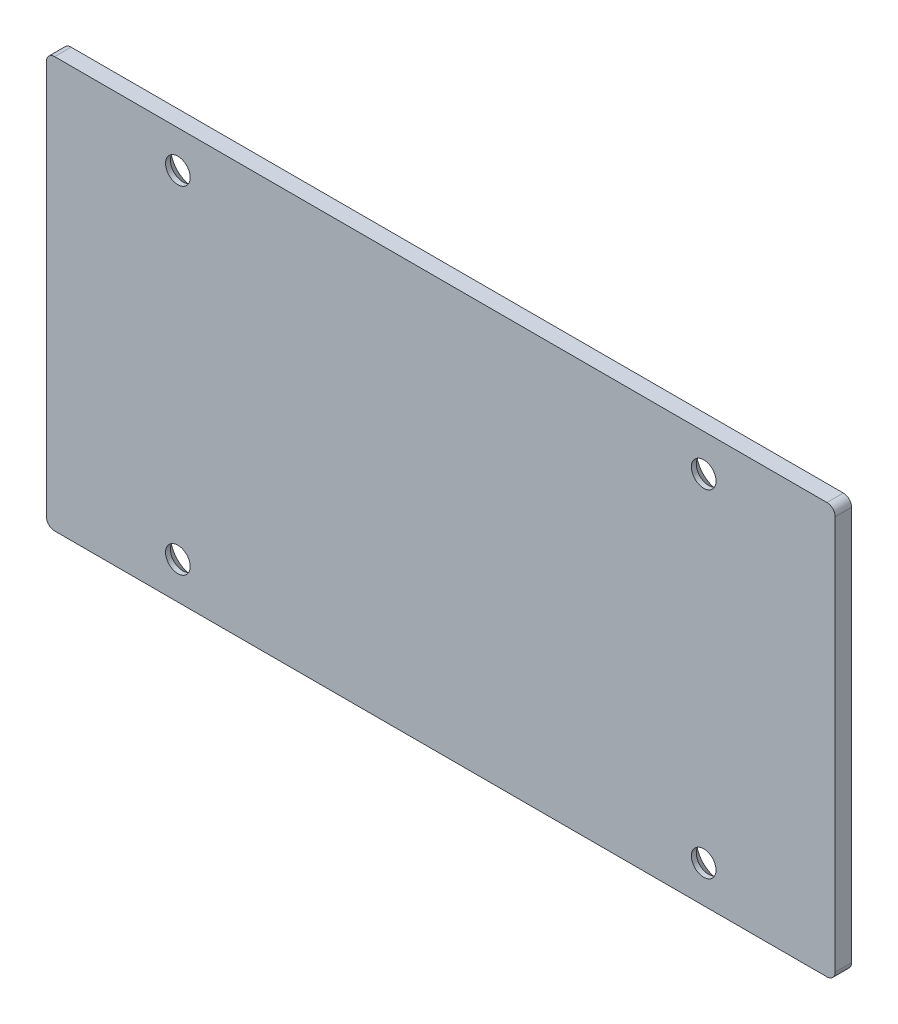
ISO-10303-21;
HEADER;
FILE_DESCRIPTION(('STEP AP214'),'2;1');
FILE_NAME('part.step','',(''),(''),'','','');
FILE_SCHEMA(('AUTOMOTIVE_DESIGN { 1 0 10303 214 1 1 1 1 }'));
ENDSEC;
DATA;
#1=APPLICATION_CONTEXT('core data for automotive mechanical design processes');
#2=APPLICATION_PROTOCOL_DEFINITION('international standard','automotive_design',2000,#1);
#3=PRODUCT_CONTEXT('',#1,'mechanical');
#4=PRODUCT('Part','Part','',(#3));
#5=PRODUCT_RELATED_PRODUCT_CATEGORY('part','',(#4));
#6=PRODUCT_DEFINITION_FORMATION('','',#4);
#7=PRODUCT_DEFINITION_CONTEXT('part definition',#1,'design');
#8=PRODUCT_DEFINITION('design','',#6,#7);
#9=PRODUCT_DEFINITION_SHAPE('','',#8);
#10=(LENGTH_UNIT() NAMED_UNIT(*) SI_UNIT(.MILLI.,.METRE.));
#11=(NAMED_UNIT(*) PLANE_ANGLE_UNIT() SI_UNIT($,.RADIAN.));
#12=(NAMED_UNIT(*) SI_UNIT($,.STERADIAN.) SOLID_ANGLE_UNIT());
#13=UNCERTAINTY_MEASURE_WITH_UNIT(LENGTH_MEASURE(1.E-05),#10,'distance_accuracy_value','');
#14=(GEOMETRIC_REPRESENTATION_CONTEXT(3) GLOBAL_UNCERTAINTY_ASSIGNED_CONTEXT((#13)) GLOBAL_UNIT_ASSIGNED_CONTEXT((#10,
#11,#12)) REPRESENTATION_CONTEXT('',''));
#15=CARTESIAN_POINT('',(0.,0.,0.));
#16=DIRECTION('',(0.,0.,1.));
#17=DIRECTION('',(1.,0.,0.));
#18=AXIS2_PLACEMENT_3D('',#15,#16,#17);
#19=CARTESIAN_POINT('',(83.5501340685274,23.0437550274658,58.7537987872683));
#20=DIRECTION('',(0.,0.,-1.));
#21=DIRECTION('',(-1.,0.,0.));
#22=AXIS2_PLACEMENT_3D('',#19,#20,#21);
#23=PLANE('',#22);
#24=CARTESIAN_POINT('',(68.5501340685274,26.5437550274658,58.7537987872683));
#25=DIRECTION('',(0.,0.,-1.));
#26=DIRECTION('',(-1.,0.,0.));
#27=AXIS2_PLACEMENT_3D('',#24,#25,#26);
#28=CIRCLE('',#27,2.9);
#29=CARTESIAN_POINT('',(65.6501340685274,26.5437550274658,58.7537987872683));
#30=VERTEX_POINT('',#29);
#31=EDGE_CURVE('E176',#30,#30,#28,.F.);
#32=ORIENTED_EDGE('',*,*,#31,.T.);
#33=EDGE_LOOP('',(#32));
#34=FACE_BOUND('',#33,.T.);
#35=CARTESIAN_POINT('',(4.55013406852741,26.5437550274658,58.7537987872683));
#36=DIRECTION('',(0.,0.,-1.));
#37=DIRECTION('',(-1.,0.,0.));
#38=AXIS2_PLACEMENT_3D('',#35,#36,#37);
#39=CIRCLE('',#38,2.9);
#40=CARTESIAN_POINT('',(1.65013406852741,26.5437550274658,58.7537987872683));
#41=VERTEX_POINT('',#40);
#42=EDGE_CURVE('E173',#41,#41,#39,.F.);
#43=ORIENTED_EDGE('',*,*,#42,.T.);
#44=EDGE_LOOP('',(#43));
#45=FACE_BOUND('',#44,.T.);
#46=CARTESIAN_POINT('',(4.55013406852741,67.5437550274658,58.7537987872683));
#47=DIRECTION('',(0.,0.,-1.));
#48=DIRECTION('',(-1.,0.,0.));
#49=AXIS2_PLACEMENT_3D('',#46,#47,#48);
#50=CIRCLE('',#49,2.9);
#51=CARTESIAN_POINT('',(1.65013406852741,67.5437550274658,58.7537987872683));
#52=VERTEX_POINT('',#51);
#53=EDGE_CURVE('E170',#52,#52,#50,.F.);
#54=ORIENTED_EDGE('',*,*,#53,.T.);
#55=EDGE_LOOP('',(#54));
#56=FACE_BOUND('',#55,.T.);
#57=CARTESIAN_POINT('',(68.5501340685274,67.5437550274658,58.7537987872683));
#58=DIRECTION('',(0.,0.,-1.));
#59=DIRECTION('',(-1.,0.,0.));
#60=AXIS2_PLACEMENT_3D('',#57,#58,#59);
#61=CIRCLE('',#60,2.9);
#62=CARTESIAN_POINT('',(65.6501340685274,67.5437550274658,58.7537987872683));
#63=VERTEX_POINT('',#62);
#64=EDGE_CURVE('E167',#63,#63,#61,.F.);
#65=ORIENTED_EDGE('',*,*,#64,.T.);
#66=EDGE_LOOP('',(#65));
#67=FACE_BOUND('',#66,.T.);
#68=DIRECTION('',(0.,-1.,0.));
#69=VECTOR('',#68,1.);
#70=CARTESIAN_POINT('',(84.5501340685274,29.5437550274658,58.7537987872683));
#71=LINE('',#70,#69);
#72=CARTESIAN_POINT('',(84.5501340685274,71.0437550274658,58.7537987872683));
#73=VERTEX_POINT('',#72);
#74=CARTESIAN_POINT('',(84.5501340685274,23.0437550274658,58.7537987872683));
#75=VERTEX_POINT('',#74);
#76=EDGE_CURVE('E51',#73,#75,#71,.T.);
#77=ORIENTED_EDGE('',*,*,#76,.T.);
#78=CARTESIAN_POINT('',(83.5501340685274,23.0437550274658,58.7537987872683));
#79=DIRECTION('',(0.,0.,-1.));
#80=DIRECTION('',(-1.,0.,0.));
#81=AXIS2_PLACEMENT_3D('',#78,#79,#80);
#82=CIRCLE('',#81,1.);
#83=CARTESIAN_POINT('',(83.5501340685274,22.0437550274658,58.7537987872683));
#84=VERTEX_POINT('',#83);
#85=EDGE_CURVE('E97',#75,#84,#82,.T.);
#86=ORIENTED_EDGE('',*,*,#85,.T.);
#87=DIRECTION('',(-1.,0.,0.));
#88=VECTOR('',#87,1.);
#89=CARTESIAN_POINT('',(83.5501340685274,22.0437550274658,58.7537987872683));
#90=LINE('',#89,#88);
#91=CARTESIAN_POINT('',(-10.4498659314726,22.0437550274658,58.7537987872683));
#92=VERTEX_POINT('',#91);
#93=EDGE_CURVE('E271',#84,#92,#90,.T.);
#94=ORIENTED_EDGE('',*,*,#93,.T.);
#95=CARTESIAN_POINT('',(-10.4498659314726,23.0437550274658,58.7537987872683));
#96=DIRECTION('',(0.,0.,-1.));
#97=DIRECTION('',(-1.,0.,0.));
#98=AXIS2_PLACEMENT_3D('',#95,#96,#97);
#99=CIRCLE('',#98,1.);
#100=CARTESIAN_POINT('',(-11.4498659314726,23.0437550274658,58.7537987872683));
#101=VERTEX_POINT('',#100);
#102=EDGE_CURVE('E273',#92,#101,#99,.T.);
#103=ORIENTED_EDGE('',*,*,#102,.T.);
#104=DIRECTION('',(0.,1.,0.));
#105=VECTOR('',#104,1.);
#106=CARTESIAN_POINT('',(-11.4498659314726,23.0437550274658,58.7537987872683));
#107=LINE('',#106,#105);
#108=CARTESIAN_POINT('',(-11.4498659314726,71.0437550274658,58.7537987872683));
#109=VERTEX_POINT('',#108);
#110=EDGE_CURVE('E116',#101,#109,#107,.T.);
#111=ORIENTED_EDGE('',*,*,#110,.T.);
#112=CARTESIAN_POINT('',(-10.4498659314726,71.0437550274658,58.7537987872683));
#113=DIRECTION('',(0.,0.,-1.));
#114=DIRECTION('',(-1.,0.,0.));
#115=AXIS2_PLACEMENT_3D('',#112,#113,#114);
#116=CIRCLE('',#115,1.);
#117=CARTESIAN_POINT('',(-10.4498659314726,72.0437550274658,58.7537987872683));
#118=VERTEX_POINT('',#117);
#119=EDGE_CURVE('E111',#109,#118,#116,.T.);
#120=ORIENTED_EDGE('',*,*,#119,.T.);
#121=DIRECTION('',(1.,0.,0.));
#122=VECTOR('',#121,1.);
#123=CARTESIAN_POINT('',(-10.4498659314726,72.0437550274658,58.7537987872683));
#124=LINE('',#123,#122);
#125=CARTESIAN_POINT('',(83.5501340685274,72.0437550274658,58.7537987872683));
#126=VERTEX_POINT('',#125);
#127=EDGE_CURVE('E114',#118,#126,#124,.T.);
#128=ORIENTED_EDGE('',*,*,#127,.T.);
#129=CARTESIAN_POINT('',(83.5501340685274,71.0437550274658,58.7537987872683));
#130=DIRECTION('',(0.,0.,-1.));
#131=DIRECTION('',(-1.,0.,0.));
#132=AXIS2_PLACEMENT_3D('',#129,#130,#131);
#133=CIRCLE('',#132,1.);
#134=EDGE_CURVE('E130',#126,#73,#133,.T.);
#135=ORIENTED_EDGE('',*,*,#134,.T.);
#136=EDGE_LOOP('',(#77,#86,#94,#103,#111,#120,#128,#135));
#137=FACE_BOUND('',#136,.T.);
#138=ADVANCED_FACE('F34',(#34,#45,#56,#67,#137),#23,.T.);
#139=CARTESIAN_POINT('',(83.5501340685274,23.0437550274658,60.7537987872683));
#140=DIRECTION('',(0.,0.,-1.));
#141=DIRECTION('',(-1.,0.,0.));
#142=AXIS2_PLACEMENT_3D('',#139,#140,#141);
#143=PLANE('',#142);
#144=CARTESIAN_POINT('',(83.5501340685274,23.0437550274658,60.7537987872683));
#145=DIRECTION('',(0.,0.,-1.));
#146=DIRECTION('',(-1.,0.,0.));
#147=AXIS2_PLACEMENT_3D('',#144,#145,#146);
#148=CIRCLE('',#147,1.);
#149=CARTESIAN_POINT('',(84.5501340685274,23.0437550274658,60.7537987872683));
#150=VERTEX_POINT('',#149);
#151=CARTESIAN_POINT('',(83.5501340685274,22.0437550274658,60.7537987872683));
#152=VERTEX_POINT('',#151);
#153=EDGE_CURVE('E136',#150,#152,#148,.T.);
#154=ORIENTED_EDGE('',*,*,#153,.F.);
#155=DIRECTION('',(0.,-1.,0.));
#156=VECTOR('',#155,1.);
#157=CARTESIAN_POINT('',(84.5501340685274,64.5437550274658,60.7537987872683));
#158=LINE('',#157,#156);
#159=CARTESIAN_POINT('',(84.5501340685274,71.0437550274658,60.7537987872683));
#160=VERTEX_POINT('',#159);
#161=EDGE_CURVE('E88',#160,#150,#158,.T.);
#162=ORIENTED_EDGE('',*,*,#161,.F.);
#163=CARTESIAN_POINT('',(83.5501340685274,71.0437550274658,60.7537987872683));
#164=DIRECTION('',(0.,0.,-1.));
#165=DIRECTION('',(-1.,0.,0.));
#166=AXIS2_PLACEMENT_3D('',#163,#164,#165);
#167=CIRCLE('',#166,1.);
#168=CARTESIAN_POINT('',(83.5501340685274,72.0437550274658,60.7537987872683));
#169=VERTEX_POINT('',#168);
#170=EDGE_CURVE('E147',#169,#160,#167,.T.);
#171=ORIENTED_EDGE('',*,*,#170,.F.);
#172=DIRECTION('',(1.,0.,0.));
#173=VECTOR('',#172,1.);
#174=CARTESIAN_POINT('',(-10.4498659314726,72.0437550274658,60.7537987872683));
#175=LINE('',#174,#173);
#176=CARTESIAN_POINT('',(-10.4498659314726,72.0437550274658,60.7537987872683));
#177=VERTEX_POINT('',#176);
#178=EDGE_CURVE('E81',#177,#169,#175,.T.);
#179=ORIENTED_EDGE('',*,*,#178,.F.);
#180=CARTESIAN_POINT('',(-10.4498659314726,71.0437550274658,60.7537987872683));
#181=DIRECTION('',(0.,0.,-1.));
#182=DIRECTION('',(-1.,0.,0.));
#183=AXIS2_PLACEMENT_3D('',#180,#181,#182);
#184=CIRCLE('',#183,1.);
#185=CARTESIAN_POINT('',(-11.4498659314726,71.0437550274658,60.7537987872683));
#186=VERTEX_POINT('',#185);
#187=EDGE_CURVE('E124',#186,#177,#184,.T.);
#188=ORIENTED_EDGE('',*,*,#187,.F.);
#189=DIRECTION('',(0.,1.,0.));
#190=VECTOR('',#189,1.);
#191=CARTESIAN_POINT('',(-11.4498659314726,23.0437550274658,60.7537987872683));
#192=LINE('',#191,#190);
#193=CARTESIAN_POINT('',(-11.4498659314726,23.0437550274658,60.7537987872683));
#194=VERTEX_POINT('',#193);
#195=EDGE_CURVE('E143',#194,#186,#192,.T.);
#196=ORIENTED_EDGE('',*,*,#195,.F.);
#197=CARTESIAN_POINT('',(-10.4498659314726,23.0437550274658,60.7537987872683));
#198=DIRECTION('',(0.,0.,-1.));
#199=DIRECTION('',(-1.,0.,0.));
#200=AXIS2_PLACEMENT_3D('',#197,#198,#199);
#201=CIRCLE('',#200,1.);
#202=CARTESIAN_POINT('',(-10.4498659314726,22.0437550274658,60.7537987872683));
#203=VERTEX_POINT('',#202);
#204=EDGE_CURVE('E141',#203,#194,#201,.T.);
#205=ORIENTED_EDGE('',*,*,#204,.F.);
#206=DIRECTION('',(-1.,0.,0.));
#207=VECTOR('',#206,1.);
#208=CARTESIAN_POINT('',(83.5501340685274,22.0437550274658,60.7537987872683));
#209=LINE('',#208,#207);
#210=EDGE_CURVE('E138',#152,#203,#209,.T.);
#211=ORIENTED_EDGE('',*,*,#210,.F.);
#212=EDGE_LOOP('',(#154,#162,#171,#179,#188,#196,#205,#211));
#213=FACE_BOUND('',#212,.T.);
#214=CARTESIAN_POINT('',(4.55013406852741,67.5437550274658,60.7537987872683));
#215=DIRECTION('',(0.,0.,-1.));
#216=DIRECTION('',(-1.,0.,0.));
#217=AXIS2_PLACEMENT_3D('',#214,#215,#216);
#218=CIRCLE('',#217,1.5);
#219=CARTESIAN_POINT('',(3.05013406852741,67.5437550274658,60.7537987872683));
#220=VERTEX_POINT('',#219);
#221=EDGE_CURVE('E139',#220,#220,#218,.T.);
#222=ORIENTED_EDGE('',*,*,#221,.T.);
#223=EDGE_LOOP('',(#222));
#224=FACE_BOUND('',#223,.T.);
#225=CARTESIAN_POINT('',(68.5501340685274,67.5437550274658,60.7537987872683));
#226=DIRECTION('',(0.,0.,-1.));
#227=DIRECTION('',(-1.,0.,0.));
#228=AXIS2_PLACEMENT_3D('',#225,#226,#227);
#229=CIRCLE('',#228,1.5);
#230=CARTESIAN_POINT('',(67.0501340685274,67.5437550274658,60.7537987872683));
#231=VERTEX_POINT('',#230);
#232=EDGE_CURVE('E259',#231,#231,#229,.T.);
#233=ORIENTED_EDGE('',*,*,#232,.T.);
#234=EDGE_LOOP('',(#233));
#235=FACE_BOUND('',#234,.T.);
#236=CARTESIAN_POINT('',(68.5501340685274,26.5437550274658,60.7537987872683));
#237=DIRECTION('',(0.,0.,-1.));
#238=DIRECTION('',(-1.,0.,0.));
#239=AXIS2_PLACEMENT_3D('',#236,#237,#238);
#240=CIRCLE('',#239,1.5);
#241=CARTESIAN_POINT('',(67.0501340685274,26.5437550274658,60.7537987872683));
#242=VERTEX_POINT('',#241);
#243=EDGE_CURVE('E257',#242,#242,#240,.T.);
#244=ORIENTED_EDGE('',*,*,#243,.T.);
#245=EDGE_LOOP('',(#244));
#246=FACE_BOUND('',#245,.T.);
#247=CARTESIAN_POINT('',(4.55013406852741,26.5437550274658,60.7537987872683));
#248=DIRECTION('',(0.,0.,-1.));
#249=DIRECTION('',(-1.,0.,0.));
#250=AXIS2_PLACEMENT_3D('',#247,#248,#249);
#251=CIRCLE('',#250,1.5);
#252=CARTESIAN_POINT('',(3.05013406852741,26.5437550274658,60.7537987872683));
#253=VERTEX_POINT('',#252);
#254=EDGE_CURVE('E260',#253,#253,#251,.T.);
#255=ORIENTED_EDGE('',*,*,#254,.T.);
#256=EDGE_LOOP('',(#255));
#257=FACE_BOUND('',#256,.T.);
#258=ADVANCED_FACE('F201',(#213,#224,#235,#246,#257),#143,.F.);
#259=CARTESIAN_POINT('',(83.5501340685274,23.0437550274658,58.7537987872683));
#260=DIRECTION('',(0.,0.,1.));
#261=DIRECTION('',(1.,0.,0.));
#262=AXIS2_PLACEMENT_3D('',#259,#260,#261);
#263=CYLINDRICAL_SURFACE('',#262,1.);
#264=ORIENTED_EDGE('',*,*,#153,.T.);
#265=DIRECTION('',(0.,0.,1.));
#266=VECTOR('',#265,1.);
#267=CARTESIAN_POINT('',(83.5501340685274,22.0437550274658,58.7537987872683));
#268=LINE('',#267,#266);
#269=EDGE_CURVE('E159',#84,#152,#268,.T.);
#270=ORIENTED_EDGE('',*,*,#269,.F.);
#271=ORIENTED_EDGE('',*,*,#85,.F.);
#272=DIRECTION('',(0.,0.,1.));
#273=VECTOR('',#272,1.);
#274=CARTESIAN_POINT('',(84.5501340685274,23.0437550274658,58.7537987872683));
#275=LINE('',#274,#273);
#276=EDGE_CURVE('E162',#75,#150,#275,.T.);
#277=ORIENTED_EDGE('',*,*,#276,.T.);
#278=EDGE_LOOP('',(#264,#270,#271,#277));
#279=FACE_BOUND('',#278,.T.);
#280=ADVANCED_FACE('F207',(#279),#263,.T.);
#281=CARTESIAN_POINT('',(83.5501340685274,22.0437550274658,58.7537987872683));
#282=DIRECTION('',(0.,1.,0.));
#283=DIRECTION('',(0.,0.,1.));
#284=AXIS2_PLACEMENT_3D('',#281,#282,#283);
#285=PLANE('',#284);
#286=ORIENTED_EDGE('',*,*,#210,.T.);
#287=DIRECTION('',(0.,0.,1.));
#288=VECTOR('',#287,1.);
#289=CARTESIAN_POINT('',(-10.4498659314726,22.0437550274658,58.7537987872683));
#290=LINE('',#289,#288);
#291=EDGE_CURVE('E156',#92,#203,#290,.T.);
#292=ORIENTED_EDGE('',*,*,#291,.F.);
#293=ORIENTED_EDGE('',*,*,#93,.F.);
#294=ORIENTED_EDGE('',*,*,#269,.T.);
#295=EDGE_LOOP('',(#286,#292,#293,#294));
#296=FACE_BOUND('',#295,.T.);
#297=ADVANCED_FACE('F231',(#296),#285,.F.);
#298=CARTESIAN_POINT('',(-10.4498659314726,23.0437550274658,58.7537987872683));
#299=DIRECTION('',(0.,0.,1.));
#300=DIRECTION('',(1.,0.,0.));
#301=AXIS2_PLACEMENT_3D('',#298,#299,#300);
#302=CYLINDRICAL_SURFACE('',#301,1.);
#303=ORIENTED_EDGE('',*,*,#204,.T.);
#304=DIRECTION('',(0.,0.,1.));
#305=VECTOR('',#304,1.);
#306=CARTESIAN_POINT('',(-11.4498659314726,23.0437550274658,58.7537987872683));
#307=LINE('',#306,#305);
#308=EDGE_CURVE('E153',#101,#194,#307,.T.);
#309=ORIENTED_EDGE('',*,*,#308,.F.);
#310=ORIENTED_EDGE('',*,*,#102,.F.);
#311=ORIENTED_EDGE('',*,*,#291,.T.);
#312=EDGE_LOOP('',(#303,#309,#310,#311));
#313=FACE_BOUND('',#312,.T.);
#314=ADVANCED_FACE('F227',(#313),#302,.T.);
#315=CARTESIAN_POINT('',(-11.4498659314726,23.0437550274658,58.7537987872683));
#316=DIRECTION('',(1.,0.,0.));
#317=DIRECTION('',(0.,1.,0.));
#318=AXIS2_PLACEMENT_3D('',#315,#316,#317);
#319=PLANE('',#318);
#320=ORIENTED_EDGE('',*,*,#195,.T.);
#321=DIRECTION('',(0.,0.,1.));
#322=VECTOR('',#321,1.);
#323=CARTESIAN_POINT('',(-11.4498659314726,71.0437550274658,58.7537987872683));
#324=LINE('',#323,#322);
#325=EDGE_CURVE('E125',#109,#186,#324,.T.);
#326=ORIENTED_EDGE('',*,*,#325,.F.);
#327=ORIENTED_EDGE('',*,*,#110,.F.);
#328=ORIENTED_EDGE('',*,*,#308,.T.);
#329=EDGE_LOOP('',(#320,#326,#327,#328));
#330=FACE_BOUND('',#329,.T.);
#331=ADVANCED_FACE('F224',(#330),#319,.F.);
#332=CARTESIAN_POINT('',(-10.4498659314726,71.0437550274658,58.7537987872683));
#333=DIRECTION('',(0.,0.,1.));
#334=DIRECTION('',(1.,0.,0.));
#335=AXIS2_PLACEMENT_3D('',#332,#333,#334);
#336=CYLINDRICAL_SURFACE('',#335,1.);
#337=ORIENTED_EDGE('',*,*,#187,.T.);
#338=DIRECTION('',(0.,0.,1.));
#339=VECTOR('',#338,1.);
#340=CARTESIAN_POINT('',(-10.4498659314726,72.0437550274658,58.7537987872683));
#341=LINE('',#340,#339);
#342=EDGE_CURVE('E121',#118,#177,#341,.T.);
#343=ORIENTED_EDGE('',*,*,#342,.F.);
#344=ORIENTED_EDGE('',*,*,#119,.F.);
#345=ORIENTED_EDGE('',*,*,#325,.T.);
#346=EDGE_LOOP('',(#337,#343,#344,#345));
#347=FACE_BOUND('',#346,.T.);
#348=ADVANCED_FACE('F122',(#347),#336,.T.);
#349=CARTESIAN_POINT('',(-10.4498659314726,72.0437550274658,58.7537987872683));
#350=DIRECTION('',(0.,-1.,0.));
#351=DIRECTION('',(0.,0.,-1.));
#352=AXIS2_PLACEMENT_3D('',#349,#350,#351);
#353=PLANE('',#352);
#354=ORIENTED_EDGE('',*,*,#178,.T.);
#355=DIRECTION('',(0.,0.,1.));
#356=VECTOR('',#355,1.);
#357=CARTESIAN_POINT('',(83.5501340685274,72.0437550274658,58.7537987872683));
#358=LINE('',#357,#356);
#359=EDGE_CURVE('E126',#126,#169,#358,.T.);
#360=ORIENTED_EDGE('',*,*,#359,.F.);
#361=ORIENTED_EDGE('',*,*,#127,.F.);
#362=ORIENTED_EDGE('',*,*,#342,.T.);
#363=EDGE_LOOP('',(#354,#360,#361,#362));
#364=FACE_BOUND('',#363,.T.);
#365=ADVANCED_FACE('F128',(#364),#353,.F.);
#366=CARTESIAN_POINT('',(83.5501340685274,71.0437550274658,58.7537987872683));
#367=DIRECTION('',(0.,0.,1.));
#368=DIRECTION('',(1.,0.,0.));
#369=AXIS2_PLACEMENT_3D('',#366,#367,#368);
#370=CYLINDRICAL_SURFACE('',#369,1.);
#371=ORIENTED_EDGE('',*,*,#170,.T.);
#372=DIRECTION('',(0.,0.,1.));
#373=VECTOR('',#372,1.);
#374=CARTESIAN_POINT('',(84.5501340685274,71.0437550274658,58.7537987872683));
#375=LINE('',#374,#373);
#376=EDGE_CURVE('E132',#73,#160,#375,.T.);
#377=ORIENTED_EDGE('',*,*,#376,.F.);
#378=ORIENTED_EDGE('',*,*,#134,.F.);
#379=ORIENTED_EDGE('',*,*,#359,.T.);
#380=EDGE_LOOP('',(#371,#377,#378,#379));
#381=FACE_BOUND('',#380,.T.);
#382=ADVANCED_FACE('F216',(#381),#370,.T.);
#383=CARTESIAN_POINT('',(84.5501340685274,64.5437550274658,58.7537987872683));
#384=DIRECTION('',(-1.,0.,0.));
#385=DIRECTION('',(0.,0.,1.));
#386=AXIS2_PLACEMENT_3D('',#383,#384,#385);
#387=PLANE('',#386);
#388=ORIENTED_EDGE('',*,*,#161,.T.);
#389=ORIENTED_EDGE('',*,*,#276,.F.);
#390=ORIENTED_EDGE('',*,*,#76,.F.);
#391=ORIENTED_EDGE('',*,*,#376,.T.);
#392=EDGE_LOOP('',(#388,#389,#390,#391));
#393=FACE_BOUND('',#392,.T.);
#394=ADVANCED_FACE('F213',(#393),#387,.F.);
#395=CARTESIAN_POINT('',(4.55013406852741,67.5437550274658,58.7537987872683));
#396=DIRECTION('',(0.,0.,1.));
#397=DIRECTION('',(1.,0.,0.));
#398=AXIS2_PLACEMENT_3D('',#395,#396,#397);
#399=CYLINDRICAL_SURFACE('',#398,1.5);
#400=CARTESIAN_POINT('',(4.55013406852741,67.5437550274658,60.1537987872683));
#401=DIRECTION('',(0.,0.,-1.));
#402=DIRECTION('',(-1.,0.,0.));
#403=AXIS2_PLACEMENT_3D('',#400,#401,#402);
#404=CIRCLE('',#403,1.5);
#405=CARTESIAN_POINT('',(3.05013406852741,67.5437550274658,60.1537987872683));
#406=VERTEX_POINT('',#405);
#407=EDGE_CURVE('E43',#406,#406,#404,.T.);
#408=ORIENTED_EDGE('',*,*,#407,.T.);
#409=EDGE_LOOP('',(#408));
#410=FACE_BOUND('',#409,.T.);
#411=ORIENTED_EDGE('',*,*,#221,.F.);
#412=EDGE_LOOP('',(#411));
#413=FACE_BOUND('',#412,.T.);
#414=ADVANCED_FACE('F184',(#410,#413),#399,.F.);
#415=CARTESIAN_POINT('',(68.5501340685274,67.5437550274658,58.7537987872683));
#416=DIRECTION('',(0.,0.,1.));
#417=DIRECTION('',(1.,0.,0.));
#418=AXIS2_PLACEMENT_3D('',#415,#416,#417);
#419=CYLINDRICAL_SURFACE('',#418,1.5);
#420=CARTESIAN_POINT('',(68.5501340685274,67.5437550274658,60.1537987872683));
#421=DIRECTION('',(0.,0.,-1.));
#422=DIRECTION('',(-1.,0.,0.));
#423=AXIS2_PLACEMENT_3D('',#420,#421,#422);
#424=CIRCLE('',#423,1.5);
#425=CARTESIAN_POINT('',(67.0501340685274,67.5437550274658,60.1537987872683));
#426=VERTEX_POINT('',#425);
#427=EDGE_CURVE('E11',#426,#426,#424,.T.);
#428=ORIENTED_EDGE('',*,*,#427,.T.);
#429=EDGE_LOOP('',(#428));
#430=FACE_BOUND('',#429,.T.);
#431=ORIENTED_EDGE('',*,*,#232,.F.);
#432=EDGE_LOOP('',(#431));
#433=FACE_BOUND('',#432,.T.);
#434=ADVANCED_FACE('F253',(#430,#433),#419,.F.);
#435=CARTESIAN_POINT('',(68.5501340685274,26.5437550274658,58.7537987872683));
#436=DIRECTION('',(0.,0.,1.));
#437=DIRECTION('',(1.,0.,0.));
#438=AXIS2_PLACEMENT_3D('',#435,#436,#437);
#439=CYLINDRICAL_SURFACE('',#438,1.5);
#440=CARTESIAN_POINT('',(68.5501340685274,26.5437550274658,60.1537987872683));
#441=DIRECTION('',(0.,0.,-1.));
#442=DIRECTION('',(-1.,0.,0.));
#443=AXIS2_PLACEMENT_3D('',#440,#441,#442);
#444=CIRCLE('',#443,1.5);
#445=CARTESIAN_POINT('',(67.0501340685274,26.5437550274658,60.1537987872683));
#446=VERTEX_POINT('',#445);
#447=EDGE_CURVE('E164',#446,#446,#444,.T.);
#448=ORIENTED_EDGE('',*,*,#447,.T.);
#449=EDGE_LOOP('',(#448));
#450=FACE_BOUND('',#449,.T.);
#451=ORIENTED_EDGE('',*,*,#243,.F.);
#452=EDGE_LOOP('',(#451));
#453=FACE_BOUND('',#452,.T.);
#454=ADVANCED_FACE('F244',(#450,#453),#439,.F.);
#455=CARTESIAN_POINT('',(4.55013406852741,26.5437550274658,58.7537987872683));
#456=DIRECTION('',(0.,0.,1.));
#457=DIRECTION('',(1.,0.,0.));
#458=AXIS2_PLACEMENT_3D('',#455,#456,#457);
#459=CYLINDRICAL_SURFACE('',#458,1.5);
#460=CARTESIAN_POINT('',(4.55013406852741,26.5437550274658,60.1537987872683));
#461=DIRECTION('',(0.,0.,-1.));
#462=DIRECTION('',(-1.,0.,0.));
#463=AXIS2_PLACEMENT_3D('',#460,#461,#462);
#464=CIRCLE('',#463,1.5);
#465=CARTESIAN_POINT('',(3.05013406852741,26.5437550274658,60.1537987872683));
#466=VERTEX_POINT('',#465);
#467=EDGE_CURVE('E179',#466,#466,#464,.T.);
#468=ORIENTED_EDGE('',*,*,#467,.T.);
#469=EDGE_LOOP('',(#468));
#470=FACE_BOUND('',#469,.T.);
#471=ORIENTED_EDGE('',*,*,#254,.F.);
#472=EDGE_LOOP('',(#471));
#473=FACE_BOUND('',#472,.T.);
#474=ADVANCED_FACE('F239',(#470,#473),#459,.F.);
#475=CARTESIAN_POINT('',(68.5501340685274,26.5437550274658,60.1537987872683));
#476=DIRECTION('',(0.,0.,-1.));
#477=DIRECTION('',(-1.,0.,0.));
#478=AXIS2_PLACEMENT_3D('',#475,#476,#477);
#479=CONICAL_SURFACE('',#478,1.5,0.78539816339745);
#480=CARTESIAN_POINT('',(65.6501340685274,26.5437550274658,58.7537987872683));
#481=CARTESIAN_POINT('',(65.6647174018608,26.5437550274658,58.7683821206016));
#482=CARTESIAN_POINT('',(65.6793007351941,26.5437550274658,58.7829654539349));
#483=CARTESIAN_POINT('',(65.7084674018608,26.5437550274658,58.8121321206016));
#484=CARTESIAN_POINT('',(65.7230507351941,26.5437550274658,58.8267154539349));
#485=CARTESIAN_POINT('',(65.7522174018608,26.5437550274658,58.8558821206016));
#486=CARTESIAN_POINT('',(65.7668007351941,26.5437550274658,58.8704654539349));
#487=CARTESIAN_POINT('',(65.7959674018608,26.5437550274658,58.8996321206016));
#488=CARTESIAN_POINT('',(65.8105507351941,26.5437550274658,58.9142154539349));
#489=CARTESIAN_POINT('',(65.8397174018608,26.5437550274658,58.9433821206016));
#490=CARTESIAN_POINT('',(65.8543007351941,26.5437550274658,58.9579654539349));
#491=CARTESIAN_POINT('',(65.8834674018608,26.5437550274658,58.9871321206016));
#492=CARTESIAN_POINT('',(65.8980507351941,26.5437550274658,59.0017154539349));
#493=CARTESIAN_POINT('',(65.9272174018607,26.5437550274658,59.0308821206016));
#494=CARTESIAN_POINT('',(65.9418007351941,26.5437550274658,59.0454654539349));
#495=CARTESIAN_POINT('',(65.9709674018608,26.5437550274658,59.0746321206016));
#496=CARTESIAN_POINT('',(65.9855507351941,26.5437550274658,59.0892154539349));
#497=CARTESIAN_POINT('',(66.0147174018608,26.5437550274658,59.1183821206016));
#498=CARTESIAN_POINT('',(66.0293007351941,26.5437550274658,59.1329654539349));
#499=CARTESIAN_POINT('',(66.0584674018608,26.5437550274658,59.1621321206016));
#500=CARTESIAN_POINT('',(66.0730507351941,26.5437550274658,59.1767154539349));
#501=CARTESIAN_POINT('',(66.1022174018608,26.5437550274658,59.2058821206016));
#502=CARTESIAN_POINT('',(66.1168007351941,26.5437550274658,59.2204654539349));
#503=CARTESIAN_POINT('',(66.1459674018608,26.5437550274658,59.2496321206016));
#504=CARTESIAN_POINT('',(66.1605507351941,26.5437550274658,59.2642154539349));
#505=CARTESIAN_POINT('',(66.1897174018607,26.5437550274658,59.2933821206016));
#506=CARTESIAN_POINT('',(66.2043007351941,26.5437550274658,59.3079654539349));
#507=CARTESIAN_POINT('',(66.2334674018608,26.5437550274658,59.3371321206016));
#508=CARTESIAN_POINT('',(66.2480507351941,26.5437550274658,59.3517154539349));
#509=CARTESIAN_POINT('',(66.2772174018608,26.5437550274658,59.3808821206016));
#510=CARTESIAN_POINT('',(66.2918007351941,26.5437550274658,59.3954654539349));
#511=CARTESIAN_POINT('',(66.3209674018608,26.5437550274658,59.4246321206016));
#512=CARTESIAN_POINT('',(66.3355507351941,26.5437550274658,59.4392154539349));
#513=CARTESIAN_POINT('',(66.3647174018608,26.5437550274658,59.4683821206016));
#514=CARTESIAN_POINT('',(66.3793007351941,26.5437550274658,59.4829654539349));
#515=CARTESIAN_POINT('',(66.4084674018607,26.5437550274658,59.5121321206016));
#516=CARTESIAN_POINT('',(66.4230507351941,26.5437550274658,59.5267154539349));
#517=CARTESIAN_POINT('',(66.4522174018608,26.5437550274658,59.5558821206016));
#518=CARTESIAN_POINT('',(66.4668007351941,26.5437550274658,59.5704654539349));
#519=CARTESIAN_POINT('',(66.4959674018608,26.5437550274658,59.5996321206016));
#520=CARTESIAN_POINT('',(66.5105507351941,26.5437550274658,59.6142154539349));
#521=CARTESIAN_POINT('',(66.5397174018608,26.5437550274658,59.6433821206016));
#522=CARTESIAN_POINT('',(66.5543007351941,26.5437550274658,59.6579654539349));
#523=CARTESIAN_POINT('',(66.5834674018608,26.5437550274658,59.6871321206016));
#524=CARTESIAN_POINT('',(66.5980507351941,26.5437550274658,59.7017154539349));
#525=CARTESIAN_POINT('',(66.6272174018608,26.5437550274658,59.7308821206016));
#526=CARTESIAN_POINT('',(66.6418007351941,26.5437550274658,59.7454654539349));
#527=CARTESIAN_POINT('',(66.6709674018608,26.5437550274658,59.7746321206016));
#528=CARTESIAN_POINT('',(66.6855507351941,26.5437550274658,59.7892154539349));
#529=CARTESIAN_POINT('',(66.7147174018608,26.5437550274658,59.8183821206016));
#530=CARTESIAN_POINT('',(66.7293007351941,26.5437550274658,59.8329654539349));
#531=CARTESIAN_POINT('',(66.7584674018608,26.5437550274658,59.8621321206016));
#532=CARTESIAN_POINT('',(66.7730507351941,26.5437550274658,59.8767154539349));
#533=CARTESIAN_POINT('',(66.8022174018607,26.5437550274658,59.9058821206016));
#534=CARTESIAN_POINT('',(66.8168007351941,26.5437550274658,59.9204654539349));
#535=CARTESIAN_POINT('',(66.8459674018608,26.5437550274658,59.9496321206016));
#536=CARTESIAN_POINT('',(66.8605507351941,26.5437550274658,59.9642154539349));
#537=CARTESIAN_POINT('',(66.8897174018608,26.5437550274658,59.9933821206016));
#538=CARTESIAN_POINT('',(66.9043007351941,26.5437550274658,60.0079654539349));
#539=CARTESIAN_POINT('',(66.9334674018608,26.5437550274658,60.0371321206016));
#540=CARTESIAN_POINT('',(66.9480507351941,26.5437550274658,60.0517154539349));
#541=CARTESIAN_POINT('',(66.9772174018608,26.5437550274658,60.0808821206016));
#542=CARTESIAN_POINT('',(66.9918007351941,26.5437550274658,60.0954654539349));
#543=CARTESIAN_POINT('',(67.0209674018608,26.5437550274658,60.1246321206016));
#544=CARTESIAN_POINT('',(67.0355507351941,26.5437550274658,60.1392154539349));
#545=CARTESIAN_POINT('',(67.0501340685274,26.5437550274658,60.1537987872683));
#546=B_SPLINE_CURVE_WITH_KNOTS('',3,(#480,#481,#482,#483,#484,#485,#486,#487,#488,#489,#490,
#491,#492,#493,#494,#495,#496,#497,#498,#499,#500,#501,#502,#503,#504,#505,#506,#507,#508,#509,
#510,#511,#512,#513,#514,#515,#516,#517,#518,#519,#520,#521,#522,#523,#524,#525,#526,#527,#528,
#529,#530,#531,#532,#533,#534,#535,#536,#537,#538,#539,#540,#541,#542,#543,#544,#545),
.UNSPECIFIED.,.F.,.F.,(4,2,2,2,2,2,2,2,2,2,2,2,2,2,2,2,2,2,2,2,2,2,2,2,2,2,2,2,2,2,2,2,4),(0.,
0.0618718433538259,0.123743686707647,0.185615530061468,0.247487373415294,0.309359216769115,
0.371231060122936,0.433102903476762,0.494974746830583,0.556846590184404,0.61871843353823,
0.680590276892051,0.742462120245872,0.804333963599698,0.866205806953519,0.92807765030735,
0.98994949366117,1.05182133701499,1.11369318036882,1.17556502372264,1.23743686707645,
1.29930871043029,1.36118055378411,1.42305239713792,1.48492424049175,1.54679608384557,
1.60866792719939,1.67053977055322,1.73241161390704,1.79428345726086,1.85615530061469,
1.91802714396851,1.97989898732234),.UNSPECIFIED.);
#547=EDGE_CURVE('BSEAM196',#30,#446,#546,.T.);
#548=ORIENTED_EDGE('',*,*,#31,.F.);
#549=ORIENTED_EDGE('',*,*,#447,.F.);
#550=ORIENTED_EDGE('',*,*,#547,.T.);
#551=ORIENTED_EDGE('',*,*,#547,.F.);
#552=EDGE_LOOP('',(#548,#550,#549,#551));
#553=FACE_BOUND('',#552,.T.);
#554=ADVANCED_FACE('F196',(#553),#479,.F.);
#555=CARTESIAN_POINT('',(4.55013406852741,26.5437550274658,60.1537987872683));
#556=DIRECTION('',(0.,0.,-1.));
#557=DIRECTION('',(-1.,0.,0.));
#558=AXIS2_PLACEMENT_3D('',#555,#556,#557);
#559=CONICAL_SURFACE('',#558,1.5,0.785398163397449);
#560=CARTESIAN_POINT('',(1.65013406852741,26.5437550274658,58.7537987872683));
#561=CARTESIAN_POINT('',(1.66471740186075,26.5437550274658,58.7683821206016));
#562=CARTESIAN_POINT('',(1.67930073519408,26.5437550274658,58.7829654539349));
#563=CARTESIAN_POINT('',(1.70846740186075,26.5437550274658,58.8121321206016));
#564=CARTESIAN_POINT('',(1.72305073519408,26.5437550274658,58.8267154539349));
#565=CARTESIAN_POINT('',(1.75221740186075,26.5437550274658,58.8558821206016));
#566=CARTESIAN_POINT('',(1.76680073519408,26.5437550274658,58.8704654539349));
#567=CARTESIAN_POINT('',(1.79596740186075,26.5437550274658,58.8996321206016));
#568=CARTESIAN_POINT('',(1.81055073519408,26.5437550274658,58.9142154539349));
#569=CARTESIAN_POINT('',(1.83971740186075,26.5437550274658,58.9433821206016));
#570=CARTESIAN_POINT('',(1.85430073519408,26.5437550274658,58.9579654539349));
#571=CARTESIAN_POINT('',(1.88346740186075,26.5437550274658,58.9871321206016));
#572=CARTESIAN_POINT('',(1.89805073519408,26.5437550274658,59.0017154539349));
#573=CARTESIAN_POINT('',(1.92721740186075,26.5437550274658,59.0308821206016));
#574=CARTESIAN_POINT('',(1.94180073519408,26.5437550274658,59.0454654539349));
#575=CARTESIAN_POINT('',(1.97096740186075,26.5437550274658,59.0746321206016));
#576=CARTESIAN_POINT('',(1.98555073519408,26.5437550274658,59.0892154539349));
#577=CARTESIAN_POINT('',(2.01471740186075,26.5437550274658,59.1183821206016));
#578=CARTESIAN_POINT('',(2.02930073519408,26.5437550274658,59.1329654539349));
#579=CARTESIAN_POINT('',(2.05846740186075,26.5437550274658,59.1621321206016));
#580=CARTESIAN_POINT('',(2.07305073519408,26.5437550274658,59.1767154539349));
#581=CARTESIAN_POINT('',(2.10221740186075,26.5437550274658,59.2058821206016));
#582=CARTESIAN_POINT('',(2.11680073519408,26.5437550274658,59.2204654539349));
#583=CARTESIAN_POINT('',(2.14596740186075,26.5437550274658,59.2496321206016));
#584=CARTESIAN_POINT('',(2.16055073519408,26.5437550274658,59.2642154539349));
#585=CARTESIAN_POINT('',(2.18971740186075,26.5437550274658,59.2933821206016));
#586=CARTESIAN_POINT('',(2.20430073519408,26.5437550274658,59.3079654539349));
#587=CARTESIAN_POINT('',(2.23346740186075,26.5437550274658,59.3371321206016));
#588=CARTESIAN_POINT('',(2.24805073519408,26.5437550274658,59.3517154539349));
#589=CARTESIAN_POINT('',(2.27721740186075,26.5437550274658,59.3808821206016));
#590=CARTESIAN_POINT('',(2.29180073519408,26.5437550274658,59.3954654539349));
#591=CARTESIAN_POINT('',(2.32096740186075,26.5437550274658,59.4246321206016));
#592=CARTESIAN_POINT('',(2.33555073519408,26.5437550274658,59.4392154539349));
#593=CARTESIAN_POINT('',(2.36471740186075,26.5437550274658,59.4683821206016));
#594=CARTESIAN_POINT('',(2.37930073519408,26.5437550274658,59.4829654539349));
#595=CARTESIAN_POINT('',(2.40846740186075,26.5437550274658,59.5121321206016));
#596=CARTESIAN_POINT('',(2.42305073519408,26.5437550274658,59.5267154539349));
#597=CARTESIAN_POINT('',(2.45221740186075,26.5437550274658,59.5558821206016));
#598=CARTESIAN_POINT('',(2.46680073519408,26.5437550274658,59.5704654539349));
#599=CARTESIAN_POINT('',(2.49596740186075,26.5437550274658,59.5996321206016));
#600=CARTESIAN_POINT('',(2.51055073519408,26.5437550274658,59.6142154539349));
#601=CARTESIAN_POINT('',(2.53971740186075,26.5437550274658,59.6433821206016));
#602=CARTESIAN_POINT('',(2.55430073519408,26.5437550274658,59.6579654539349));
#603=CARTESIAN_POINT('',(2.58346740186075,26.5437550274658,59.6871321206016));
#604=CARTESIAN_POINT('',(2.59805073519408,26.5437550274658,59.7017154539349));
#605=CARTESIAN_POINT('',(2.62721740186075,26.5437550274658,59.7308821206016));
#606=CARTESIAN_POINT('',(2.64180073519408,26.5437550274658,59.7454654539349));
#607=CARTESIAN_POINT('',(2.67096740186075,26.5437550274658,59.7746321206016));
#608=CARTESIAN_POINT('',(2.68555073519408,26.5437550274658,59.7892154539349));
#609=CARTESIAN_POINT('',(2.71471740186075,26.5437550274658,59.8183821206016));
#610=CARTESIAN_POINT('',(2.72930073519408,26.5437550274658,59.8329654539349));
#611=CARTESIAN_POINT('',(2.75846740186075,26.5437550274658,59.8621321206016));
#612=CARTESIAN_POINT('',(2.77305073519408,26.5437550274658,59.8767154539349));
#613=CARTESIAN_POINT('',(2.80221740186075,26.5437550274658,59.9058821206016));
#614=CARTESIAN_POINT('',(2.81680073519408,26.5437550274658,59.9204654539349));
#615=CARTESIAN_POINT('',(2.84596740186075,26.5437550274658,59.9496321206016));
#616=CARTESIAN_POINT('',(2.86055073519408,26.5437550274658,59.9642154539349));
#617=CARTESIAN_POINT('',(2.88971740186075,26.5437550274658,59.9933821206016));
#618=CARTESIAN_POINT('',(2.90430073519408,26.5437550274658,60.0079654539349));
#619=CARTESIAN_POINT('',(2.93346740186075,26.5437550274658,60.0371321206016));
#620=CARTESIAN_POINT('',(2.94805073519408,26.5437550274658,60.0517154539349));
#621=CARTESIAN_POINT('',(2.97721740186075,26.5437550274658,60.0808821206016));
#622=CARTESIAN_POINT('',(2.99180073519408,26.5437550274658,60.0954654539349));
#623=CARTESIAN_POINT('',(3.02096740186075,26.5437550274658,60.1246321206016));
#624=CARTESIAN_POINT('',(3.03555073519408,26.5437550274658,60.1392154539349));
#625=CARTESIAN_POINT('',(3.05013406852741,26.5437550274658,60.1537987872683));
#626=B_SPLINE_CURVE_WITH_KNOTS('',3,(#560,#561,#562,#563,#564,#565,#566,#567,#568,#569,#570,
#571,#572,#573,#574,#575,#576,#577,#578,#579,#580,#581,#582,#583,#584,#585,#586,#587,#588,#589,
#590,#591,#592,#593,#594,#595,#596,#597,#598,#599,#600,#601,#602,#603,#604,#605,#606,#607,#608,
#609,#610,#611,#612,#613,#614,#615,#616,#617,#618,#619,#620,#621,#622,#623,#624,#625),
.UNSPECIFIED.,.F.,.F.,(4,2,2,2,2,2,2,2,2,2,2,2,2,2,2,2,2,2,2,2,2,2,2,2,2,2,2,2,2,2,2,2,4),(0.,
0.0618718433538195,0.123743686707644,0.185615530061468,0.247487373415288,0.309359216769112,
0.371231060122936,0.433102903476756,0.49497474683058,0.556846590184405,0.618718433538224,
0.680590276892049,0.742462120245873,0.804333963599693,0.866205806953517,0.928077650307342,
0.989949493661166,1.05182133701499,1.11369318036881,1.17556502372263,1.23743686707645,
1.29930871043028,1.3611805537841,1.42305239713792,1.48492424049175,1.54679608384557,
1.60866792719939,1.67053977055321,1.73241161390704,1.79428345726086,1.85615530061468,
1.91802714396851,1.97989898732233),.UNSPECIFIED.);
#627=EDGE_CURVE('BSEAM189',#41,#466,#626,.T.);
#628=ORIENTED_EDGE('',*,*,#42,.F.);
#629=ORIENTED_EDGE('',*,*,#467,.F.);
#630=ORIENTED_EDGE('',*,*,#627,.T.);
#631=ORIENTED_EDGE('',*,*,#627,.F.);
#632=EDGE_LOOP('',(#628,#630,#629,#631));
#633=FACE_BOUND('',#632,.T.);
#634=ADVANCED_FACE('F189',(#633),#559,.F.);
#635=CARTESIAN_POINT('',(4.55013406852741,67.5437550274658,60.1537987872683));
#636=DIRECTION('',(0.,0.,-1.));
#637=DIRECTION('',(-1.,0.,0.));
#638=AXIS2_PLACEMENT_3D('',#635,#636,#637);
#639=CONICAL_SURFACE('',#638,1.5,0.785398163397449);
#640=CARTESIAN_POINT('',(1.65013406852741,67.5437550274658,58.7537987872683));
#641=CARTESIAN_POINT('',(1.66471740186075,67.5437550274658,58.7683821206016));
#642=CARTESIAN_POINT('',(1.67930073519408,67.5437550274658,58.7829654539349));
#643=CARTESIAN_POINT('',(1.70846740186075,67.5437550274658,58.8121321206016));
#644=CARTESIAN_POINT('',(1.72305073519408,67.5437550274658,58.8267154539349));
#645=CARTESIAN_POINT('',(1.75221740186075,67.5437550274658,58.8558821206016));
#646=CARTESIAN_POINT('',(1.76680073519408,67.5437550274658,58.8704654539349));
#647=CARTESIAN_POINT('',(1.79596740186075,67.5437550274658,58.8996321206016));
#648=CARTESIAN_POINT('',(1.81055073519408,67.5437550274658,58.9142154539349));
#649=CARTESIAN_POINT('',(1.83971740186075,67.5437550274658,58.9433821206016));
#650=CARTESIAN_POINT('',(1.85430073519408,67.5437550274658,58.9579654539349));
#651=CARTESIAN_POINT('',(1.88346740186075,67.5437550274658,58.9871321206016));
#652=CARTESIAN_POINT('',(1.89805073519408,67.5437550274658,59.0017154539349));
#653=CARTESIAN_POINT('',(1.92721740186075,67.5437550274658,59.0308821206016));
#654=CARTESIAN_POINT('',(1.94180073519408,67.5437550274658,59.0454654539349));
#655=CARTESIAN_POINT('',(1.97096740186075,67.5437550274658,59.0746321206016));
#656=CARTESIAN_POINT('',(1.98555073519408,67.5437550274658,59.0892154539349));
#657=CARTESIAN_POINT('',(2.01471740186075,67.5437550274658,59.1183821206016));
#658=CARTESIAN_POINT('',(2.02930073519408,67.5437550274658,59.1329654539349));
#659=CARTESIAN_POINT('',(2.05846740186075,67.5437550274658,59.1621321206016));
#660=CARTESIAN_POINT('',(2.07305073519408,67.5437550274658,59.1767154539349));
#661=CARTESIAN_POINT('',(2.10221740186075,67.5437550274658,59.2058821206016));
#662=CARTESIAN_POINT('',(2.11680073519408,67.5437550274658,59.2204654539349));
#663=CARTESIAN_POINT('',(2.14596740186075,67.5437550274658,59.2496321206016));
#664=CARTESIAN_POINT('',(2.16055073519408,67.5437550274658,59.2642154539349));
#665=CARTESIAN_POINT('',(2.18971740186075,67.5437550274658,59.2933821206016));
#666=CARTESIAN_POINT('',(2.20430073519408,67.5437550274658,59.3079654539349));
#667=CARTESIAN_POINT('',(2.23346740186075,67.5437550274658,59.3371321206016));
#668=CARTESIAN_POINT('',(2.24805073519408,67.5437550274658,59.3517154539349));
#669=CARTESIAN_POINT('',(2.27721740186075,67.5437550274658,59.3808821206016));
#670=CARTESIAN_POINT('',(2.29180073519408,67.5437550274658,59.3954654539349));
#671=CARTESIAN_POINT('',(2.32096740186075,67.5437550274658,59.4246321206016));
#672=CARTESIAN_POINT('',(2.33555073519408,67.5437550274658,59.4392154539349));
#673=CARTESIAN_POINT('',(2.36471740186075,67.5437550274658,59.4683821206016));
#674=CARTESIAN_POINT('',(2.37930073519408,67.5437550274658,59.4829654539349));
#675=CARTESIAN_POINT('',(2.40846740186075,67.5437550274658,59.5121321206016));
#676=CARTESIAN_POINT('',(2.42305073519408,67.5437550274658,59.5267154539349));
#677=CARTESIAN_POINT('',(2.45221740186075,67.5437550274658,59.5558821206016));
#678=CARTESIAN_POINT('',(2.46680073519408,67.5437550274658,59.5704654539349));
#679=CARTESIAN_POINT('',(2.49596740186075,67.5437550274658,59.5996321206016));
#680=CARTESIAN_POINT('',(2.51055073519408,67.5437550274658,59.6142154539349));
#681=CARTESIAN_POINT('',(2.53971740186075,67.5437550274658,59.6433821206016));
#682=CARTESIAN_POINT('',(2.55430073519408,67.5437550274658,59.6579654539349));
#683=CARTESIAN_POINT('',(2.58346740186075,67.5437550274658,59.6871321206016));
#684=CARTESIAN_POINT('',(2.59805073519408,67.5437550274658,59.7017154539349));
#685=CARTESIAN_POINT('',(2.62721740186075,67.5437550274658,59.7308821206016));
#686=CARTESIAN_POINT('',(2.64180073519408,67.5437550274658,59.7454654539349));
#687=CARTESIAN_POINT('',(2.67096740186075,67.5437550274658,59.7746321206016));
#688=CARTESIAN_POINT('',(2.68555073519408,67.5437550274658,59.7892154539349));
#689=CARTESIAN_POINT('',(2.71471740186075,67.5437550274658,59.8183821206016));
#690=CARTESIAN_POINT('',(2.72930073519408,67.5437550274658,59.8329654539349));
#691=CARTESIAN_POINT('',(2.75846740186075,67.5437550274658,59.8621321206016));
#692=CARTESIAN_POINT('',(2.77305073519408,67.5437550274658,59.8767154539349));
#693=CARTESIAN_POINT('',(2.80221740186075,67.5437550274658,59.9058821206016));
#694=CARTESIAN_POINT('',(2.81680073519408,67.5437550274658,59.9204654539349));
#695=CARTESIAN_POINT('',(2.84596740186075,67.5437550274658,59.9496321206016));
#696=CARTESIAN_POINT('',(2.86055073519408,67.5437550274658,59.9642154539349));
#697=CARTESIAN_POINT('',(2.88971740186075,67.5437550274658,59.9933821206016));
#698=CARTESIAN_POINT('',(2.90430073519408,67.5437550274658,60.0079654539349));
#699=CARTESIAN_POINT('',(2.93346740186075,67.5437550274658,60.0371321206016));
#700=CARTESIAN_POINT('',(2.94805073519408,67.5437550274658,60.0517154539349));
#701=CARTESIAN_POINT('',(2.97721740186075,67.5437550274658,60.0808821206016));
#702=CARTESIAN_POINT('',(2.99180073519408,67.5437550274658,60.0954654539349));
#703=CARTESIAN_POINT('',(3.02096740186075,67.5437550274658,60.1246321206016));
#704=CARTESIAN_POINT('',(3.03555073519408,67.5437550274658,60.1392154539349));
#705=CARTESIAN_POINT('',(3.05013406852741,67.5437550274658,60.1537987872683));
#706=B_SPLINE_CURVE_WITH_KNOTS('',3,(#640,#641,#642,#643,#644,#645,#646,#647,#648,#649,#650,
#651,#652,#653,#654,#655,#656,#657,#658,#659,#660,#661,#662,#663,#664,#665,#666,#667,#668,#669,
#670,#671,#672,#673,#674,#675,#676,#677,#678,#679,#680,#681,#682,#683,#684,#685,#686,#687,#688,
#689,#690,#691,#692,#693,#694,#695,#696,#697,#698,#699,#700,#701,#702,#703,#704,#705),
.UNSPECIFIED.,.F.,.F.,(4,2,2,2,2,2,2,2,2,2,2,2,2,2,2,2,2,2,2,2,2,2,2,2,2,2,2,2,2,2,2,2,4),(0.,
0.0618718433538195,0.123743686707644,0.185615530061468,0.247487373415288,0.309359216769112,
0.371231060122936,0.433102903476756,0.49497474683058,0.556846590184405,0.618718433538224,
0.680590276892049,0.742462120245873,0.804333963599693,0.866205806953517,0.928077650307342,
0.989949493661166,1.05182133701499,1.11369318036881,1.17556502372263,1.23743686707645,
1.29930871043028,1.3611805537841,1.42305239713792,1.48492424049175,1.54679608384557,
1.60866792719939,1.67053977055321,1.73241161390704,1.79428345726086,1.85615530061468,
1.91802714396851,1.97989898732233),.UNSPECIFIED.);
#707=EDGE_CURVE('BSEAM187',#52,#406,#706,.T.);
#708=ORIENTED_EDGE('',*,*,#53,.F.);
#709=ORIENTED_EDGE('',*,*,#407,.F.);
#710=ORIENTED_EDGE('',*,*,#707,.T.);
#711=ORIENTED_EDGE('',*,*,#707,.F.);
#712=EDGE_LOOP('',(#708,#710,#709,#711));
#713=FACE_BOUND('',#712,.T.);
#714=ADVANCED_FACE('F187',(#713),#639,.F.);
#715=CARTESIAN_POINT('',(68.5501340685274,67.5437550274658,60.1537987872683));
#716=DIRECTION('',(0.,0.,-1.));
#717=DIRECTION('',(-1.,0.,0.));
#718=AXIS2_PLACEMENT_3D('',#715,#716,#717);
#719=CONICAL_SURFACE('',#718,1.5,0.78539816339745);
#720=CARTESIAN_POINT('',(65.6501340685274,67.5437550274658,58.7537987872683));
#721=CARTESIAN_POINT('',(65.6647174018608,67.5437550274658,58.7683821206016));
#722=CARTESIAN_POINT('',(65.6793007351941,67.5437550274658,58.7829654539349));
#723=CARTESIAN_POINT('',(65.7084674018608,67.5437550274658,58.8121321206016));
#724=CARTESIAN_POINT('',(65.7230507351941,67.5437550274658,58.8267154539349));
#725=CARTESIAN_POINT('',(65.7522174018608,67.5437550274658,58.8558821206016));
#726=CARTESIAN_POINT('',(65.7668007351941,67.5437550274658,58.8704654539349));
#727=CARTESIAN_POINT('',(65.7959674018608,67.5437550274658,58.8996321206016));
#728=CARTESIAN_POINT('',(65.8105507351941,67.5437550274658,58.9142154539349));
#729=CARTESIAN_POINT('',(65.8397174018608,67.5437550274658,58.9433821206016));
#730=CARTESIAN_POINT('',(65.8543007351941,67.5437550274658,58.9579654539349));
#731=CARTESIAN_POINT('',(65.8834674018608,67.5437550274658,58.9871321206016));
#732=CARTESIAN_POINT('',(65.8980507351941,67.5437550274658,59.0017154539349));
#733=CARTESIAN_POINT('',(65.9272174018607,67.5437550274658,59.0308821206016));
#734=CARTESIAN_POINT('',(65.9418007351941,67.5437550274658,59.0454654539349));
#735=CARTESIAN_POINT('',(65.9709674018608,67.5437550274658,59.0746321206016));
#736=CARTESIAN_POINT('',(65.9855507351941,67.5437550274658,59.0892154539349));
#737=CARTESIAN_POINT('',(66.0147174018608,67.5437550274658,59.1183821206016));
#738=CARTESIAN_POINT('',(66.0293007351941,67.5437550274658,59.1329654539349));
#739=CARTESIAN_POINT('',(66.0584674018608,67.5437550274658,59.1621321206016));
#740=CARTESIAN_POINT('',(66.0730507351941,67.5437550274658,59.1767154539349));
#741=CARTESIAN_POINT('',(66.1022174018608,67.5437550274658,59.2058821206016));
#742=CARTESIAN_POINT('',(66.1168007351941,67.5437550274658,59.2204654539349));
#743=CARTESIAN_POINT('',(66.1459674018608,67.5437550274658,59.2496321206016));
#744=CARTESIAN_POINT('',(66.1605507351941,67.5437550274658,59.2642154539349));
#745=CARTESIAN_POINT('',(66.1897174018607,67.5437550274658,59.2933821206016));
#746=CARTESIAN_POINT('',(66.2043007351941,67.5437550274658,59.3079654539349));
#747=CARTESIAN_POINT('',(66.2334674018608,67.5437550274658,59.3371321206016));
#748=CARTESIAN_POINT('',(66.2480507351941,67.5437550274658,59.3517154539349));
#749=CARTESIAN_POINT('',(66.2772174018608,67.5437550274658,59.3808821206016));
#750=CARTESIAN_POINT('',(66.2918007351941,67.5437550274658,59.3954654539349));
#751=CARTESIAN_POINT('',(66.3209674018608,67.5437550274658,59.4246321206016));
#752=CARTESIAN_POINT('',(66.3355507351941,67.5437550274658,59.4392154539349));
#753=CARTESIAN_POINT('',(66.3647174018608,67.5437550274658,59.4683821206016));
#754=CARTESIAN_POINT('',(66.3793007351941,67.5437550274658,59.4829654539349));
#755=CARTESIAN_POINT('',(66.4084674018607,67.5437550274658,59.5121321206016));
#756=CARTESIAN_POINT('',(66.4230507351941,67.5437550274658,59.5267154539349));
#757=CARTESIAN_POINT('',(66.4522174018608,67.5437550274658,59.5558821206016));
#758=CARTESIAN_POINT('',(66.4668007351941,67.5437550274658,59.5704654539349));
#759=CARTESIAN_POINT('',(66.4959674018608,67.5437550274658,59.5996321206016));
#760=CARTESIAN_POINT('',(66.5105507351941,67.5437550274658,59.6142154539349));
#761=CARTESIAN_POINT('',(66.5397174018608,67.5437550274658,59.6433821206016));
#762=CARTESIAN_POINT('',(66.5543007351941,67.5437550274658,59.6579654539349));
#763=CARTESIAN_POINT('',(66.5834674018608,67.5437550274658,59.6871321206016));
#764=CARTESIAN_POINT('',(66.5980507351941,67.5437550274658,59.7017154539349));
#765=CARTESIAN_POINT('',(66.6272174018608,67.5437550274658,59.7308821206016));
#766=CARTESIAN_POINT('',(66.6418007351941,67.5437550274658,59.7454654539349));
#767=CARTESIAN_POINT('',(66.6709674018608,67.5437550274658,59.7746321206016));
#768=CARTESIAN_POINT('',(66.6855507351941,67.5437550274658,59.7892154539349));
#769=CARTESIAN_POINT('',(66.7147174018608,67.5437550274658,59.8183821206016));
#770=CARTESIAN_POINT('',(66.7293007351941,67.5437550274658,59.8329654539349));
#771=CARTESIAN_POINT('',(66.7584674018608,67.5437550274658,59.8621321206016));
#772=CARTESIAN_POINT('',(66.7730507351941,67.5437550274658,59.8767154539349));
#773=CARTESIAN_POINT('',(66.8022174018607,67.5437550274658,59.9058821206016));
#774=CARTESIAN_POINT('',(66.8168007351941,67.5437550274658,59.9204654539349));
#775=CARTESIAN_POINT('',(66.8459674018608,67.5437550274658,59.9496321206016));
#776=CARTESIAN_POINT('',(66.8605507351941,67.5437550274658,59.9642154539349));
#777=CARTESIAN_POINT('',(66.8897174018608,67.5437550274658,59.9933821206016));
#778=CARTESIAN_POINT('',(66.9043007351941,67.5437550274658,60.0079654539349));
#779=CARTESIAN_POINT('',(66.9334674018608,67.5437550274658,60.0371321206016));
#780=CARTESIAN_POINT('',(66.9480507351941,67.5437550274658,60.0517154539349));
#781=CARTESIAN_POINT('',(66.9772174018608,67.5437550274658,60.0808821206016));
#782=CARTESIAN_POINT('',(66.9918007351941,67.5437550274658,60.0954654539349));
#783=CARTESIAN_POINT('',(67.0209674018608,67.5437550274658,60.1246321206016));
#784=CARTESIAN_POINT('',(67.0355507351941,67.5437550274658,60.1392154539349));
#785=CARTESIAN_POINT('',(67.0501340685274,67.5437550274658,60.1537987872683));
#786=B_SPLINE_CURVE_WITH_KNOTS('',3,(#720,#721,#722,#723,#724,#725,#726,#727,#728,#729,#730,
#731,#732,#733,#734,#735,#736,#737,#738,#739,#740,#741,#742,#743,#744,#745,#746,#747,#748,#749,
#750,#751,#752,#753,#754,#755,#756,#757,#758,#759,#760,#761,#762,#763,#764,#765,#766,#767,#768,
#769,#770,#771,#772,#773,#774,#775,#776,#777,#778,#779,#780,#781,#782,#783,#784,#785),
.UNSPECIFIED.,.F.,.F.,(4,2,2,2,2,2,2,2,2,2,2,2,2,2,2,2,2,2,2,2,2,2,2,2,2,2,2,2,2,2,2,2,4),(0.,
0.0618718433538259,0.123743686707647,0.185615530061468,0.247487373415294,0.309359216769115,
0.371231060122936,0.433102903476762,0.494974746830583,0.556846590184404,0.61871843353823,
0.680590276892051,0.742462120245872,0.804333963599698,0.866205806953519,0.92807765030735,
0.98994949366117,1.05182133701499,1.11369318036882,1.17556502372264,1.23743686707645,
1.29930871043029,1.36118055378411,1.42305239713792,1.48492424049175,1.54679608384557,
1.60866792719939,1.67053977055322,1.73241161390704,1.79428345726086,1.85615530061469,
1.91802714396851,1.97989898732234),.UNSPECIFIED.);
#787=EDGE_CURVE('BSEAM36',#63,#426,#786,.T.);
#788=ORIENTED_EDGE('',*,*,#64,.F.);
#789=ORIENTED_EDGE('',*,*,#427,.F.);
#790=ORIENTED_EDGE('',*,*,#787,.T.);
#791=ORIENTED_EDGE('',*,*,#787,.F.);
#792=EDGE_LOOP('',(#788,#790,#789,#791));
#793=FACE_BOUND('',#792,.T.);
#794=ADVANCED_FACE('F36',(#793),#719,.F.);
#795=CLOSED_SHELL('',(#138,#258,#280,#297,#314,#331,#348,#365,#382,#394,#414,#434,#454,#474,
#554,#634,#714,#794));
#796=MANIFOLD_SOLID_BREP('B2',#795);
#797=ADVANCED_BREP_SHAPE_REPRESENTATION('',(#18,#796),#14);
#798=SHAPE_DEFINITION_REPRESENTATION(#9,#797);
ENDSEC;
END-ISO-10303-21;
